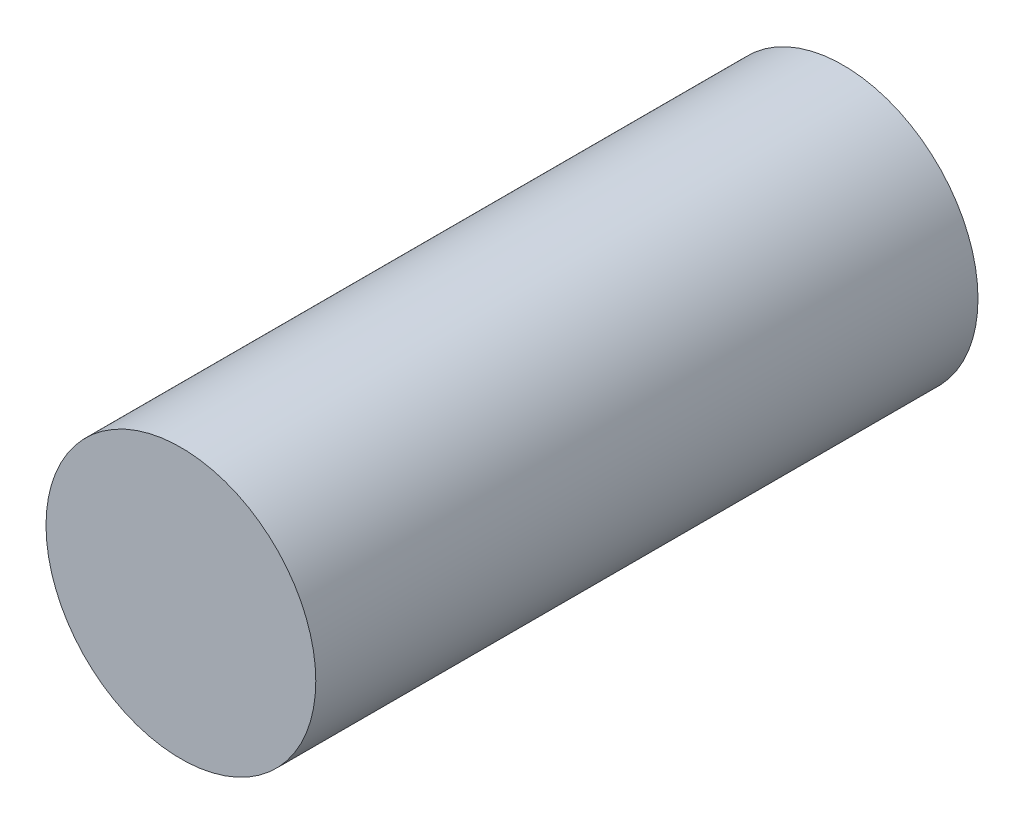
ISO-10303-21;
HEADER;
FILE_DESCRIPTION(('STEP AP214'),'2;1');
FILE_NAME('part.step','',(''),(''),'','','');
FILE_SCHEMA(('AUTOMOTIVE_DESIGN { 1 0 10303 214 1 1 1 1 }'));
ENDSEC;
DATA;
#1=APPLICATION_CONTEXT('core data for automotive mechanical design processes');
#2=APPLICATION_PROTOCOL_DEFINITION('international standard','automotive_design',2000,#1);
#3=PRODUCT_CONTEXT('',#1,'mechanical');
#4=PRODUCT('Part','Part','',(#3));
#5=PRODUCT_RELATED_PRODUCT_CATEGORY('part','',(#4));
#6=PRODUCT_DEFINITION_FORMATION('','',#4);
#7=PRODUCT_DEFINITION_CONTEXT('part definition',#1,'design');
#8=PRODUCT_DEFINITION('design','',#6,#7);
#9=PRODUCT_DEFINITION_SHAPE('','',#8);
#10=(LENGTH_UNIT() NAMED_UNIT(*) SI_UNIT(.MILLI.,.METRE.));
#11=(NAMED_UNIT(*) PLANE_ANGLE_UNIT() SI_UNIT($,.RADIAN.));
#12=(NAMED_UNIT(*) SI_UNIT($,.STERADIAN.) SOLID_ANGLE_UNIT());
#13=UNCERTAINTY_MEASURE_WITH_UNIT(LENGTH_MEASURE(1.E-05),#10,'distance_accuracy_value','');
#14=(GEOMETRIC_REPRESENTATION_CONTEXT(3) GLOBAL_UNCERTAINTY_ASSIGNED_CONTEXT((#13)) GLOBAL_UNIT_ASSIGNED_CONTEXT((#10,
#11,#12)) REPRESENTATION_CONTEXT('',''));
#15=CARTESIAN_POINT('',(0.,0.,0.));
#16=DIRECTION('',(0.,0.,1.));
#17=DIRECTION('',(1.,0.,0.));
#18=AXIS2_PLACEMENT_3D('',#15,#16,#17);
#19=CARTESIAN_POINT('',(0.,0.,0.));
#20=DIRECTION('',(0.,0.,1.));
#21=DIRECTION('',(1.,0.,0.));
#22=AXIS2_PLACEMENT_3D('',#19,#20,#21);
#23=PLANE('',#22);
#24=CARTESIAN_POINT('',(0.,0.,0.));
#25=DIRECTION('',(0.,0.,-1.));
#26=DIRECTION('',(-1.,0.,0.));
#27=AXIS2_PLACEMENT_3D('',#24,#25,#26);
#28=CIRCLE('',#27,0.27500072);
#29=CARTESIAN_POINT('',(-0.27500072,0.,0.));
#30=VERTEX_POINT('',#29);
#31=EDGE_CURVE('E18',#30,#30,#28,.F.);
#32=ORIENTED_EDGE('',*,*,#31,.F.);
#33=EDGE_LOOP('',(#32));
#34=FACE_BOUND('',#33,.T.);
#35=ADVANCED_FACE('F15',(#34),#23,.F.);
#36=CARTESIAN_POINT('',(0.,0.,1.34999984));
#37=DIRECTION('',(0.,0.,1.));
#38=DIRECTION('',(1.,0.,0.));
#39=AXIS2_PLACEMENT_3D('',#36,#37,#38);
#40=PLANE('',#39);
#41=CARTESIAN_POINT('',(0.,0.,1.34999984));
#42=DIRECTION('',(0.,0.,-1.));
#43=DIRECTION('',(-1.,0.,0.));
#44=AXIS2_PLACEMENT_3D('',#41,#42,#43);
#45=CIRCLE('',#44,0.27500072);
#46=CARTESIAN_POINT('',(-0.27500072,0.,1.34999984));
#47=VERTEX_POINT('',#46);
#48=EDGE_CURVE('E10',#47,#47,#45,.T.);
#49=ORIENTED_EDGE('',*,*,#48,.F.);
#50=EDGE_LOOP('',(#49));
#51=FACE_BOUND('',#50,.T.);
#52=ADVANCED_FACE('F30',(#51),#40,.T.);
#53=CARTESIAN_POINT('',(0.,0.,0.));
#54=DIRECTION('',(0.,0.,-1.));
#55=DIRECTION('',(-1.,0.,0.));
#56=AXIS2_PLACEMENT_3D('',#53,#54,#55);
#57=CYLINDRICAL_SURFACE('',#56,0.27500072);
#58=ORIENTED_EDGE('',*,*,#48,.T.);
#59=EDGE_LOOP('',(#58));
#60=FACE_BOUND('',#59,.T.);
#61=ORIENTED_EDGE('',*,*,#31,.T.);
#62=EDGE_LOOP('',(#61));
#63=FACE_BOUND('',#62,.T.);
#64=ADVANCED_FACE('F27',(#60,#63),#57,.T.);
#65=CLOSED_SHELL('',(#35,#52,#64));
#66=MANIFOLD_SOLID_BREP('B1',#65);
#67=ADVANCED_BREP_SHAPE_REPRESENTATION('',(#18,#66),#14);
#68=SHAPE_DEFINITION_REPRESENTATION(#9,#67);
ENDSEC;
END-ISO-10303-21;
